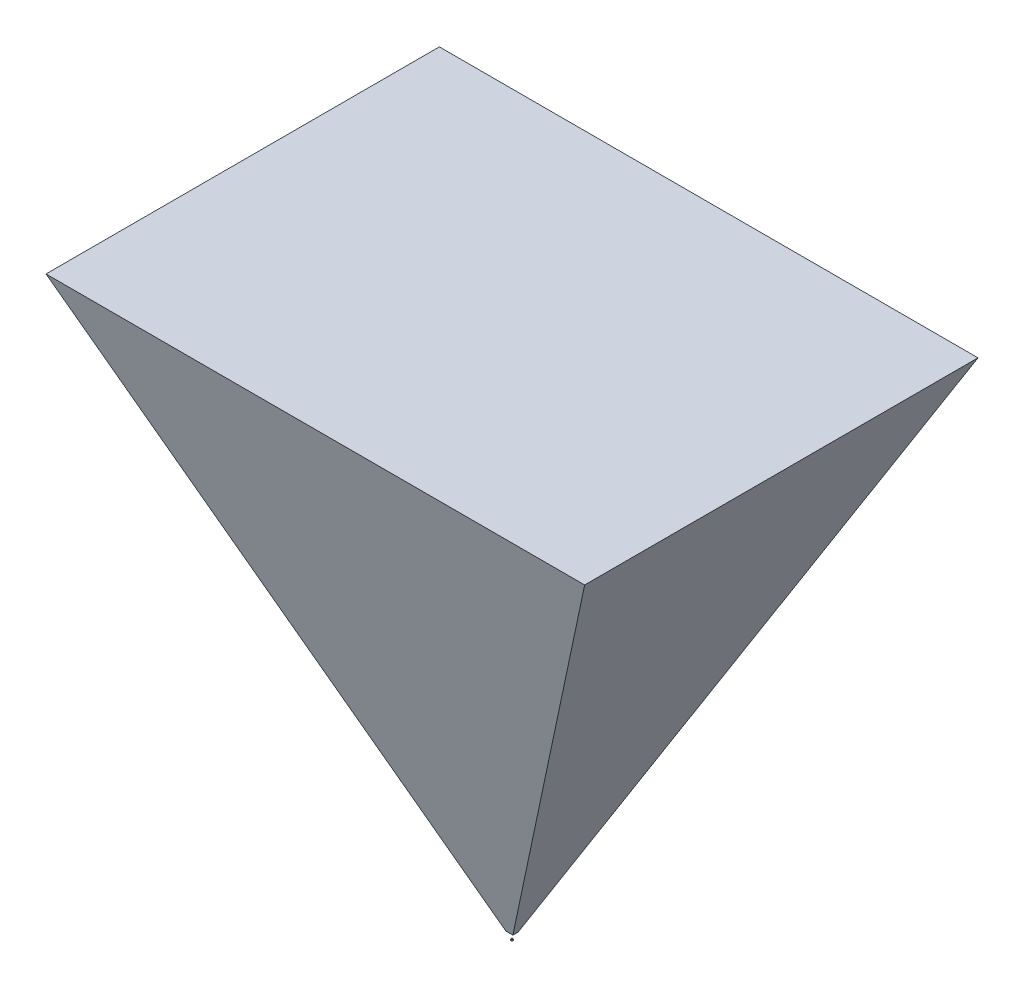
ISO-10303-21;
HEADER;
FILE_DESCRIPTION(('STEP AP214'),'2;1');
FILE_NAME('part.step','',(''),(''),'','','');
FILE_SCHEMA(('AUTOMOTIVE_DESIGN { 1 0 10303 214 1 1 1 1 }'));
ENDSEC;
DATA;
#1=APPLICATION_CONTEXT('core data for automotive mechanical design processes');
#2=APPLICATION_PROTOCOL_DEFINITION('international standard','automotive_design',2000,#1);
#3=PRODUCT_CONTEXT('',#1,'mechanical');
#4=PRODUCT('Part','Part','',(#3));
#5=PRODUCT_RELATED_PRODUCT_CATEGORY('part','',(#4));
#6=PRODUCT_DEFINITION_FORMATION('','',#4);
#7=PRODUCT_DEFINITION_CONTEXT('part definition',#1,'design');
#8=PRODUCT_DEFINITION('design','',#6,#7);
#9=PRODUCT_DEFINITION_SHAPE('','',#8);
#10=(LENGTH_UNIT() NAMED_UNIT(*) SI_UNIT(.MILLI.,.METRE.));
#11=(NAMED_UNIT(*) PLANE_ANGLE_UNIT() SI_UNIT($,.RADIAN.));
#12=(NAMED_UNIT(*) SI_UNIT($,.STERADIAN.) SOLID_ANGLE_UNIT());
#13=UNCERTAINTY_MEASURE_WITH_UNIT(LENGTH_MEASURE(1.E-05),#10,'distance_accuracy_value','');
#14=(GEOMETRIC_REPRESENTATION_CONTEXT(3) GLOBAL_UNCERTAINTY_ASSIGNED_CONTEXT((#13)) GLOBAL_UNIT_ASSIGNED_CONTEXT((#10,
#11,#12)) REPRESENTATION_CONTEXT('',''));
#15=CARTESIAN_POINT('',(0.,0.,0.));
#16=DIRECTION('',(0.,0.,1.));
#17=DIRECTION('',(1.,0.,0.));
#18=AXIS2_PLACEMENT_3D('',#15,#16,#17);
#19=CARTESIAN_POINT('',(1500.,1518.70782661284,553.234756084626));
#20=DIRECTION('',(0.,-1.,0.));
#21=DIRECTION('',(0.,0.,-1.));
#22=AXIS2_PLACEMENT_3D('',#19,#20,#21);
#23=PLANE('',#22);
#24=DIRECTION('',(0.,0.,1.));
#25=VECTOR('',#24,1.);
#26=CARTESIAN_POINT('',(-757.612893172543,1518.70782661284,-553.234756084626));
#27=LINE('',#26,#25);
#28=CARTESIAN_POINT('',(-757.612893172542,1518.70782661284,-553.234756084626));
#29=VERTEX_POINT('',#28);
#30=CARTESIAN_POINT('',(-757.612893172542,1518.70782661284,553.234756084626));
#31=VERTEX_POINT('',#30);
#32=EDGE_CURVE('E67',#29,#31,#27,.T.);
#33=ORIENTED_EDGE('',*,*,#32,.T.);
#34=DIRECTION('',(-1.,0.,0.));
#35=VECTOR('',#34,1.);
#36=CARTESIAN_POINT('',(1500.,1518.70782661284,553.234756084626));
#37=LINE('',#36,#35);
#38=CARTESIAN_POINT('',(757.612893172543,1518.70782661284,553.234756084626));
#39=VERTEX_POINT('',#38);
#40=EDGE_CURVE('E97',#39,#31,#37,.T.);
#41=ORIENTED_EDGE('',*,*,#40,.F.);
#42=DIRECTION('',(0.,0.,1.));
#43=VECTOR('',#42,1.);
#44=CARTESIAN_POINT('',(757.612893172543,1518.70782661284,-553.234756084626));
#45=LINE('',#44,#43);
#46=CARTESIAN_POINT('',(757.612893172542,1518.70782661284,-553.234756084626));
#47=VERTEX_POINT('',#46);
#48=EDGE_CURVE('E83',#47,#39,#45,.T.);
#49=ORIENTED_EDGE('',*,*,#48,.F.);
#50=DIRECTION('',(-1.,0.,0.));
#51=VECTOR('',#50,1.);
#52=CARTESIAN_POINT('',(1500.,1518.70782661284,-553.234756084626));
#53=LINE('',#52,#51);
#54=EDGE_CURVE('E109',#47,#29,#53,.T.);
#55=ORIENTED_EDGE('',*,*,#54,.T.);
#56=EDGE_LOOP('',(#33,#41,#49,#55));
#57=FACE_BOUND('',#56,.T.);
#58=ADVANCED_FACE('F46',(#57),#23,.F.);
#59=CARTESIAN_POINT('',(1500.,18.7078266128409,7.27940468532404));
#60=DIRECTION('',(0.,0.342020143325668,-0.939692620785909));
#61=DIRECTION('',(0.,0.939692620785909,0.342020143325668));
#62=AXIS2_PLACEMENT_3D('',#59,#60,#61);
#63=PLANE('',#62);
#64=DIRECTION('',(-0.424258256279284,0.850930418263275,0.309713343679521));
#65=VECTOR('',#64,1.);
#66=CARTESIAN_POINT('',(262.0053594961,-526.330009117692,-191.098144069461));
#67=LINE('',#66,#65);
#68=CARTESIAN_POINT('',(-9.7404810923923,18.7078266128409,7.27940468532406));
#69=VERTEX_POINT('',#68);
#70=EDGE_CURVE('E100',#69,#31,#67,.T.);
#71=ORIENTED_EDGE('',*,*,#70,.F.);
#72=DIRECTION('',(-1.,0.,0.));
#73=VECTOR('',#72,1.);
#74=CARTESIAN_POINT('',(1500.,18.7078266128409,7.27940468532404));
#75=LINE('',#74,#73);
#76=CARTESIAN_POINT('',(9.7404810923923,18.7078266128409,7.27940468532406));
#77=VERTEX_POINT('',#76);
#78=EDGE_CURVE('E99',#77,#69,#75,.T.);
#79=ORIENTED_EDGE('',*,*,#78,.F.);
#80=DIRECTION('',(-0.424258256279284,-0.850930418263275,-0.309713343679521));
#81=VECTOR('',#80,1.);
#82=CARTESIAN_POINT('',(277.979844567317,556.712757284446,203.097185338239));
#83=LINE('',#82,#81);
#84=EDGE_CURVE('E86',#39,#77,#83,.T.);
#85=ORIENTED_EDGE('',*,*,#84,.F.);
#86=ORIENTED_EDGE('',*,*,#40,.T.);
#87=EDGE_LOOP('',(#71,#79,#85,#86));
#88=FACE_BOUND('',#87,.T.);
#89=ADVANCED_FACE('F96',(#88),#63,.F.);
#90=CARTESIAN_POINT('',(1500.,18.7078266128409,7.27940468532404));
#91=DIRECTION('',(0.,1.,0.));
#92=DIRECTION('',(0.,0.,1.));
#93=AXIS2_PLACEMENT_3D('',#90,#91,#92);
#94=PLANE('',#93);
#95=DIRECTION('',(0.,0.,1.));
#96=VECTOR('',#95,1.);
#97=CARTESIAN_POINT('',(-9.7404810923923,18.7078266128409,-553.234756084626));
#98=LINE('',#97,#96);
#99=CARTESIAN_POINT('',(-9.74048109239218,18.7078266128409,-7.27940468532415));
#100=VERTEX_POINT('',#99);
#101=EDGE_CURVE('E101',#100,#69,#98,.T.);
#102=ORIENTED_EDGE('',*,*,#101,.F.);
#103=DIRECTION('',(-1.,0.,0.));
#104=VECTOR('',#103,1.);
#105=CARTESIAN_POINT('',(1500.,18.7078266128409,-7.27940468532404));
#106=LINE('',#105,#104);
#107=CARTESIAN_POINT('',(9.7404810923922,18.7078266128409,-7.27940468532404));
#108=VERTEX_POINT('',#107);
#109=EDGE_CURVE('E104',#108,#100,#106,.T.);
#110=ORIENTED_EDGE('',*,*,#109,.F.);
#111=DIRECTION('',(0.,0.,1.));
#112=VECTOR('',#111,1.);
#113=CARTESIAN_POINT('',(9.7404810923923,18.7078266128409,-553.234756084626));
#114=LINE('',#113,#112);
#115=EDGE_CURVE('E60',#108,#77,#114,.T.);
#116=ORIENTED_EDGE('',*,*,#115,.T.);
#117=ORIENTED_EDGE('',*,*,#78,.T.);
#118=EDGE_LOOP('',(#102,#110,#116,#117));
#119=FACE_BOUND('',#118,.T.);
#120=ADVANCED_FACE('F118',(#119),#94,.F.);
#121=CARTESIAN_POINT('',(1500.,18.7078266128409,-7.27940468532404));
#122=DIRECTION('',(0.,0.342020143325668,0.939692620785909));
#123=DIRECTION('',(0.,-0.939692620785909,0.342020143325668));
#124=AXIS2_PLACEMENT_3D('',#121,#122,#123);
#125=PLANE('',#124);
#126=DIRECTION('',(0.424258256279284,-0.850930418263275,0.309713343679521));
#127=VECTOR('',#126,1.);
#128=CARTESIAN_POINT('',(262.0053594961,-526.330009117692,191.098144069461));
#129=LINE('',#128,#127);
#130=EDGE_CURVE('E13',#29,#100,#129,.T.);
#131=ORIENTED_EDGE('',*,*,#130,.F.);
#132=ORIENTED_EDGE('',*,*,#54,.F.);
#133=DIRECTION('',(0.424258256279284,0.850930418263275,-0.309713343679521));
#134=VECTOR('',#133,1.);
#135=CARTESIAN_POINT('',(277.979844567317,556.712757284446,-203.097185338239));
#136=LINE('',#135,#134);
#137=EDGE_CURVE('E53',#108,#47,#136,.T.);
#138=ORIENTED_EDGE('',*,*,#137,.F.);
#139=ORIENTED_EDGE('',*,*,#109,.T.);
#140=EDGE_LOOP('',(#131,#132,#138,#139));
#141=FACE_BOUND('',#140,.T.);
#142=ADVANCED_FACE('F120',(#141),#125,.F.);
#143=CARTESIAN_POINT('',(9.7404810923923,18.7078266128409,-553.234756084626));
#144=DIRECTION('',(0.894934361602024,-0.44619781310981,0.));
#145=DIRECTION('',(0.44619781310981,0.894934361602024,0.));
#146=AXIS2_PLACEMENT_3D('',#143,#144,#145);
#147=PLANE('',#146);
#148=ORIENTED_EDGE('',*,*,#84,.T.);
#149=ORIENTED_EDGE('',*,*,#115,.F.);
#150=ORIENTED_EDGE('',*,*,#137,.T.);
#151=ORIENTED_EDGE('',*,*,#48,.T.);
#152=EDGE_LOOP('',(#148,#149,#150,#151));
#153=FACE_BOUND('',#152,.T.);
#154=ADVANCED_FACE('F85',(#153),#147,.T.);
#155=CARTESIAN_POINT('',(-9.7404810923923,18.7078266128409,-553.234756084626));
#156=DIRECTION('',(-0.894934361602024,-0.44619781310981,0.));
#157=DIRECTION('',(0.44619781310981,-0.894934361602024,0.));
#158=AXIS2_PLACEMENT_3D('',#155,#156,#157);
#159=PLANE('',#158);
#160=ORIENTED_EDGE('',*,*,#70,.T.);
#161=ORIENTED_EDGE('',*,*,#32,.F.);
#162=ORIENTED_EDGE('',*,*,#130,.T.);
#163=ORIENTED_EDGE('',*,*,#101,.T.);
#164=EDGE_LOOP('',(#160,#161,#162,#163));
#165=FACE_BOUND('',#164,.T.);
#166=ADVANCED_FACE('F115',(#165),#159,.T.);
#167=CLOSED_SHELL('',(#58,#89,#120,#142,#154,#166));
#168=MANIFOLD_SOLID_BREP('B2',#167);
#169=CARTESIAN_POINT('',(1.,0.8,0.));
#170=DIRECTION('',(0.,-1.,0.));
#171=DIRECTION('',(0.,0.,-1.));
#172=AXIS2_PLACEMENT_3D('',#169,#170,#171);
#173=PLANE('',#172);
#174=CARTESIAN_POINT('',(0.,0.8,0.));
#175=DIRECTION('',(0.,1.,0.));
#176=DIRECTION('',(0.,0.,1.));
#177=AXIS2_PLACEMENT_3D('',#174,#175,#176);
#178=CIRCLE('',#177,1.);
#179=CARTESIAN_POINT('',(0.,0.8,1.));
#180=VERTEX_POINT('',#179);
#181=EDGE_CURVE('E44',#180,#180,#178,.T.);
#182=ORIENTED_EDGE('',*,*,#181,.F.);
#183=EDGE_LOOP('',(#182));
#184=FACE_BOUND('',#183,.T.);
#185=DIRECTION('',(0.,0.,-1.));
#186=VECTOR('',#185,1.);
#187=CARTESIAN_POINT('',(0.,0.8,2.3));
#188=LINE('',#187,#186);
#189=CARTESIAN_POINT('',(0.,0.8,2.75));
#190=VERTEX_POINT('',#189);
#191=CARTESIAN_POINT('',(0.,0.8,2.3));
#192=VERTEX_POINT('',#191);
#193=EDGE_CURVE('E256',#190,#192,#188,.T.);
#194=ORIENTED_EDGE('',*,*,#193,.T.);
#195=CARTESIAN_POINT('',(0.,0.8,0.));
#196=DIRECTION('',(0.,1.,0.));
#197=DIRECTION('',(-0.866025403784443,0.,-0.499999999999992));
#198=AXIS2_PLACEMENT_3D('',#195,#196,#197);
#199=CIRCLE('',#198,2.3);
#200=CARTESIAN_POINT('',(1.99185842870422,0.8,1.14999999999998));
#201=VERTEX_POINT('',#200);
#202=EDGE_CURVE('E241',#192,#201,#199,.T.);
#203=ORIENTED_EDGE('',*,*,#202,.T.);
#204=DIRECTION('',(-0.866025403784443,0.,-0.499999999999992));
#205=VECTOR('',#204,1.);
#206=CARTESIAN_POINT('',(1.99185842870422,0.8,1.14999999999998));
#207=LINE('',#206,#205);
#208=CARTESIAN_POINT('',(2.38156986040722,0.8,1.37499999999998));
#209=VERTEX_POINT('',#208);
#210=EDGE_CURVE('E247',#209,#201,#207,.T.);
#211=ORIENTED_EDGE('',*,*,#210,.F.);
#212=CARTESIAN_POINT('',(0.,0.8,0.));
#213=DIRECTION('',(0.,1.,0.));
#214=DIRECTION('',(0.,0.,1.));
#215=AXIS2_PLACEMENT_3D('',#212,#213,#214);
#216=CIRCLE('',#215,2.75);
#217=CARTESIAN_POINT('',(2.38156986040721,0.8,-1.37499999999999));
#218=VERTEX_POINT('',#217);
#219=EDGE_CURVE('E327',#209,#218,#216,.T.);
#220=ORIENTED_EDGE('',*,*,#219,.T.);
#221=DIRECTION('',(-0.86602540378444,0.,0.499999999999998));
#222=VECTOR('',#221,1.);
#223=CARTESIAN_POINT('',(1.99185842870421,0.8,-1.15));
#224=LINE('',#223,#222);
#225=CARTESIAN_POINT('',(1.99185842870421,0.8,-1.15));
#226=VERTEX_POINT('',#225);
#227=EDGE_CURVE('E290',#218,#226,#224,.T.);
#228=ORIENTED_EDGE('',*,*,#227,.T.);
#229=CARTESIAN_POINT('',(0.,0.8,0.));
#230=DIRECTION('',(0.,1.,0.));
#231=DIRECTION('',(0.,0.,1.));
#232=AXIS2_PLACEMENT_3D('',#229,#230,#231);
#233=CIRCLE('',#232,2.3);
#234=CARTESIAN_POINT('',(0.,0.8,-2.3));
#235=VERTEX_POINT('',#234);
#236=EDGE_CURVE('E298',#226,#235,#233,.T.);
#237=ORIENTED_EDGE('',*,*,#236,.T.);
#238=DIRECTION('',(0.,0.,1.));
#239=VECTOR('',#238,1.);
#240=CARTESIAN_POINT('',(0.,0.8,-2.3));
#241=LINE('',#240,#239);
#242=CARTESIAN_POINT('',(0.,0.8,-2.75));
#243=VERTEX_POINT('',#242);
#244=EDGE_CURVE('E283',#243,#235,#241,.T.);
#245=ORIENTED_EDGE('',*,*,#244,.F.);
#246=CARTESIAN_POINT('',(-2.38156986040721,0.8,-1.37499999999999));
#247=VERTEX_POINT('',#246);
#248=EDGE_CURVE('E178',#243,#247,#216,.T.);
#249=ORIENTED_EDGE('',*,*,#248,.T.);
#250=DIRECTION('',(0.86602540378444,0.,0.499999999999998));
#251=VECTOR('',#250,1.);
#252=CARTESIAN_POINT('',(-1.99185842870421,0.8,-1.15));
#253=LINE('',#252,#251);
#254=CARTESIAN_POINT('',(-1.99185842870421,0.8,-1.15));
#255=VERTEX_POINT('',#254);
#256=EDGE_CURVE('E270',#247,#255,#253,.T.);
#257=ORIENTED_EDGE('',*,*,#256,.T.);
#258=CARTESIAN_POINT('',(0.,0.8,0.));
#259=DIRECTION('',(0.,1.,0.));
#260=DIRECTION('',(0.866025403784436,0.,-0.500000000000004));
#261=AXIS2_PLACEMENT_3D('',#258,#259,#260);
#262=CIRCLE('',#261,2.3);
#263=CARTESIAN_POINT('',(-1.9918584287042,0.8,1.15000000000001));
#264=VERTEX_POINT('',#263);
#265=EDGE_CURVE('E278',#255,#264,#262,.T.);
#266=ORIENTED_EDGE('',*,*,#265,.T.);
#267=DIRECTION('',(0.866025403784436,0.,-0.500000000000004));
#268=VECTOR('',#267,1.);
#269=CARTESIAN_POINT('',(-1.9918584287042,0.8,1.15000000000001));
#270=LINE('',#269,#268);
#271=CARTESIAN_POINT('',(-2.3815698604072,0.8,1.37500000000001));
#272=VERTEX_POINT('',#271);
#273=EDGE_CURVE('E259',#272,#264,#270,.T.);
#274=ORIENTED_EDGE('',*,*,#273,.F.);
#275=EDGE_CURVE('E329',#272,#190,#216,.T.);
#276=ORIENTED_EDGE('',*,*,#275,.T.);
#277=EDGE_LOOP('',(#194,#203,#211,#220,#228,#237,#245,#249,#257,#266,#274,#276));
#278=FACE_BOUND('',#277,.T.);
#279=ADVANCED_FACE('F170',(#184,#278),#173,.F.);
#280=CARTESIAN_POINT('',(0.,0.,0.));
#281=DIRECTION('',(0.,1.,0.));
#282=DIRECTION('',(0.,0.,1.));
#283=AXIS2_PLACEMENT_3D('',#280,#281,#282);
#284=CYLINDRICAL_SURFACE('',#283,2.75);
#285=CARTESIAN_POINT('',(0.,-0.2,0.));
#286=DIRECTION('',(0.,-1.,0.));
#287=DIRECTION('',(0.,0.,-1.));
#288=AXIS2_PLACEMENT_3D('',#285,#286,#287);
#289=CIRCLE('',#288,2.75);
#290=CARTESIAN_POINT('',(0.,-0.2,-2.75));
#291=VERTEX_POINT('',#290);
#292=EDGE_CURVE('E304',#291,#291,#289,.T.);
#293=ORIENTED_EDGE('',*,*,#292,.F.);
#294=EDGE_LOOP('',(#293));
#295=FACE_BOUND('',#294,.T.);
#296=DIRECTION('',(0.,1.,0.));
#297=VECTOR('',#296,1.);
#298=CARTESIAN_POINT('',(0.,0.8,2.75));
#299=LINE('',#298,#297);
#300=CARTESIAN_POINT('',(0.,0.349999999999999,2.75));
#301=VERTEX_POINT('',#300);
#302=EDGE_CURVE('E257',#301,#190,#299,.T.);
#303=ORIENTED_EDGE('',*,*,#302,.T.);
#304=ORIENTED_EDGE('',*,*,#275,.F.);
#305=DIRECTION('',(0.,1.,0.));
#306=VECTOR('',#305,1.);
#307=CARTESIAN_POINT('',(-2.3815698604072,0.8,1.37500000000001));
#308=LINE('',#307,#306);
#309=CARTESIAN_POINT('',(-2.3815698604072,0.349999999999999,1.37500000000001));
#310=VERTEX_POINT('',#309);
#311=EDGE_CURVE('E268',#310,#272,#308,.T.);
#312=ORIENTED_EDGE('',*,*,#311,.F.);
#313=CARTESIAN_POINT('',(0.,0.349999999999999,0.));
#314=DIRECTION('',(0.,1.,0.));
#315=DIRECTION('',(0.866025403784436,0.,-0.500000000000004));
#316=AXIS2_PLACEMENT_3D('',#313,#314,#315);
#317=CIRCLE('',#316,2.75);
#318=CARTESIAN_POINT('',(-2.38156986040721,0.349999999999999,-1.37499999999999));
#319=VERTEX_POINT('',#318);
#320=EDGE_CURVE('E281',#319,#310,#317,.T.);
#321=ORIENTED_EDGE('',*,*,#320,.F.);
#322=DIRECTION('',(0.,1.,0.));
#323=VECTOR('',#322,1.);
#324=CARTESIAN_POINT('',(-2.38156986040721,0.8,-1.37499999999999));
#325=LINE('',#324,#323);
#326=EDGE_CURVE('E275',#319,#247,#325,.T.);
#327=ORIENTED_EDGE('',*,*,#326,.T.);
#328=ORIENTED_EDGE('',*,*,#248,.F.);
#329=DIRECTION('',(0.,1.,0.));
#330=VECTOR('',#329,1.);
#331=CARTESIAN_POINT('',(0.,0.8,-2.75));
#332=LINE('',#331,#330);
#333=CARTESIAN_POINT('',(0.,0.349999999999999,-2.75));
#334=VERTEX_POINT('',#333);
#335=EDGE_CURVE('E288',#334,#243,#332,.T.);
#336=ORIENTED_EDGE('',*,*,#335,.F.);
#337=CARTESIAN_POINT('',(0.,0.349999999999999,0.));
#338=DIRECTION('',(0.,1.,0.));
#339=DIRECTION('',(0.,0.,1.));
#340=AXIS2_PLACEMENT_3D('',#337,#338,#339);
#341=CIRCLE('',#340,2.75);
#342=CARTESIAN_POINT('',(2.38156986040721,0.349999999999999,-1.37499999999999));
#343=VERTEX_POINT('',#342);
#344=EDGE_CURVE('E301',#343,#334,#341,.T.);
#345=ORIENTED_EDGE('',*,*,#344,.F.);
#346=DIRECTION('',(0.,1.,0.));
#347=VECTOR('',#346,1.);
#348=CARTESIAN_POINT('',(2.38156986040721,0.8,-1.37499999999999));
#349=LINE('',#348,#347);
#350=EDGE_CURVE('E295',#343,#218,#349,.T.);
#351=ORIENTED_EDGE('',*,*,#350,.T.);
#352=ORIENTED_EDGE('',*,*,#219,.F.);
#353=DIRECTION('',(0.,1.,0.));
#354=VECTOR('',#353,1.);
#355=CARTESIAN_POINT('',(2.38156986040722,0.8,1.37499999999998));
#356=LINE('',#355,#354);
#357=CARTESIAN_POINT('',(2.38156986040722,0.349999999999999,1.37499999999998));
#358=VERTEX_POINT('',#357);
#359=EDGE_CURVE('E246',#358,#209,#356,.T.);
#360=ORIENTED_EDGE('',*,*,#359,.F.);
#361=CARTESIAN_POINT('',(0.,0.349999999999999,0.));
#362=DIRECTION('',(0.,1.,0.));
#363=DIRECTION('',(-0.866025403784443,0.,-0.499999999999992));
#364=AXIS2_PLACEMENT_3D('',#361,#362,#363);
#365=CIRCLE('',#364,2.75);
#366=EDGE_CURVE('E244',#301,#358,#365,.T.);
#367=ORIENTED_EDGE('',*,*,#366,.F.);
#368=EDGE_LOOP('',(#303,#304,#312,#321,#327,#328,#336,#345,#351,#352,#360,#367));
#369=FACE_BOUND('',#368,.T.);
#370=ADVANCED_FACE('F339',(#295,#369),#284,.T.);
#371=CARTESIAN_POINT('',(0.,-1.2,0.));
#372=DIRECTION('',(0.,-1.,0.));
#373=DIRECTION('',(0.,0.,-1.));
#374=AXIS2_PLACEMENT_3D('',#371,#372,#373);
#375=CIRCLE('',#374,2.75);
#376=CARTESIAN_POINT('',(0.,-1.2,-2.75));
#377=VERTEX_POINT('',#376);
#378=EDGE_CURVE('E313',#377,#377,#375,.T.);
#379=ORIENTED_EDGE('',*,*,#378,.T.);
#380=EDGE_LOOP('',(#379));
#381=FACE_BOUND('',#380,.T.);
#382=CARTESIAN_POINT('',(0.,-2.55,0.));
#383=DIRECTION('',(0.,1.,0.));
#384=DIRECTION('',(0.,0.,1.));
#385=AXIS2_PLACEMENT_3D('',#382,#383,#384);
#386=CIRCLE('',#385,2.75);
#387=CARTESIAN_POINT('',(0.,-2.55,2.75));
#388=VERTEX_POINT('',#387);
#389=EDGE_CURVE('E325',#388,#388,#386,.T.);
#390=ORIENTED_EDGE('',*,*,#389,.T.);
#391=EDGE_LOOP('',(#390));
#392=FACE_BOUND('',#391,.T.);
#393=ADVANCED_FACE('F373',(#381,#392),#284,.T.);
#394=CARTESIAN_POINT('',(2.75,-2.55,0.));
#395=DIRECTION('',(0.,1.,0.));
#396=DIRECTION('',(0.,0.,1.));
#397=AXIS2_PLACEMENT_3D('',#394,#395,#396);
#398=PLANE('',#397);
#399=ORIENTED_EDGE('',*,*,#389,.F.);
#400=EDGE_LOOP('',(#399));
#401=FACE_BOUND('',#400,.T.);
#402=CARTESIAN_POINT('',(0.,-2.55,0.));
#403=DIRECTION('',(0.,1.,0.));
#404=DIRECTION('',(0.,0.,1.));
#405=AXIS2_PLACEMENT_3D('',#402,#403,#404);
#406=CIRCLE('',#405,2.1);
#407=CARTESIAN_POINT('',(0.,-2.55,2.1));
#408=VERTEX_POINT('',#407);
#409=EDGE_CURVE('E322',#408,#408,#406,.T.);
#410=ORIENTED_EDGE('',*,*,#409,.T.);
#411=EDGE_LOOP('',(#410));
#412=FACE_BOUND('',#411,.T.);
#413=ADVANCED_FACE('F378',(#401,#412),#398,.F.);
#414=CARTESIAN_POINT('',(0.,-2.25,0.));
#415=DIRECTION('',(0.,-1.,0.));
#416=DIRECTION('',(0.,0.,-1.));
#417=AXIS2_PLACEMENT_3D('',#414,#415,#416);
#418=CONICAL_SURFACE('',#417,1.8,0.78539816339745);
#419=ORIENTED_EDGE('',*,*,#409,.F.);
#420=EDGE_LOOP('',(#419));
#421=FACE_BOUND('',#420,.T.);
#422=CARTESIAN_POINT('',(0.,-2.25,0.));
#423=DIRECTION('',(0.,1.,0.));
#424=DIRECTION('',(0.,0.,1.));
#425=AXIS2_PLACEMENT_3D('',#422,#423,#424);
#426=CIRCLE('',#425,1.8);
#427=CARTESIAN_POINT('',(0.,-2.25,1.8));
#428=VERTEX_POINT('',#427);
#429=EDGE_CURVE('E319',#428,#428,#426,.T.);
#430=ORIENTED_EDGE('',*,*,#429,.T.);
#431=EDGE_LOOP('',(#430));
#432=FACE_BOUND('',#431,.T.);
#433=ADVANCED_FACE('F381',(#421,#432),#418,.F.);
#434=CARTESIAN_POINT('',(0.,3.,0.));
#435=DIRECTION('',(0.,1.,0.));
#436=DIRECTION('',(1.,0.,0.));
#437=AXIS2_PLACEMENT_3D('',#434,#435,#436);
#438=SPHERICAL_SURFACE('',#437,5.55);
#439=ORIENTED_EDGE('',*,*,#429,.F.);
#440=EDGE_LOOP('',(#439));
#441=FACE_BOUND('',#440,.T.);
#442=ADVANCED_FACE('F385',(#441),#438,.T.);
#443=CARTESIAN_POINT('',(2.75,-1.2,0.));
#444=DIRECTION('',(0.,-1.,0.));
#445=DIRECTION('',(0.,0.,-1.));
#446=AXIS2_PLACEMENT_3D('',#443,#444,#445);
#447=PLANE('',#446);
#448=CARTESIAN_POINT('',(0.,-1.2,0.));
#449=DIRECTION('',(0.,-1.,0.));
#450=DIRECTION('',(0.,0.,-1.));
#451=AXIS2_PLACEMENT_3D('',#448,#449,#450);
#452=CIRCLE('',#451,3.);
#453=CARTESIAN_POINT('',(0.,-1.2,-3.));
#454=VERTEX_POINT('',#453);
#455=EDGE_CURVE('E310',#454,#454,#452,.T.);
#456=ORIENTED_EDGE('',*,*,#455,.T.);
#457=EDGE_LOOP('',(#456));
#458=FACE_BOUND('',#457,.T.);
#459=ORIENTED_EDGE('',*,*,#378,.F.);
#460=EDGE_LOOP('',(#459));
#461=FACE_BOUND('',#460,.T.);
#462=ADVANCED_FACE('F389',(#458,#461),#447,.T.);
#463=CARTESIAN_POINT('',(0.,0.,0.));
#464=DIRECTION('',(0.,-1.,0.));
#465=DIRECTION('',(0.,0.,-1.));
#466=AXIS2_PLACEMENT_3D('',#463,#464,#465);
#467=CYLINDRICAL_SURFACE('',#466,3.);
#468=CARTESIAN_POINT('',(0.,-0.2,0.));
#469=DIRECTION('',(0.,-1.,0.));
#470=DIRECTION('',(0.,0.,-1.));
#471=AXIS2_PLACEMENT_3D('',#468,#469,#470);
#472=CIRCLE('',#471,3.);
#473=CARTESIAN_POINT('',(0.,-0.2,-3.));
#474=VERTEX_POINT('',#473);
#475=EDGE_CURVE('E307',#474,#474,#472,.T.);
#476=ORIENTED_EDGE('',*,*,#475,.T.);
#477=EDGE_LOOP('',(#476));
#478=FACE_BOUND('',#477,.T.);
#479=ORIENTED_EDGE('',*,*,#455,.F.);
#480=EDGE_LOOP('',(#479));
#481=FACE_BOUND('',#480,.T.);
#482=ADVANCED_FACE('F398',(#478,#481),#467,.T.);
#483=CARTESIAN_POINT('',(2.75,-0.2,0.));
#484=DIRECTION('',(0.,1.,0.));
#485=DIRECTION('',(0.,0.,1.));
#486=AXIS2_PLACEMENT_3D('',#483,#484,#485);
#487=PLANE('',#486);
#488=ORIENTED_EDGE('',*,*,#292,.T.);
#489=EDGE_LOOP('',(#488));
#490=FACE_BOUND('',#489,.T.);
#491=ORIENTED_EDGE('',*,*,#475,.F.);
#492=EDGE_LOOP('',(#491));
#493=FACE_BOUND('',#492,.T.);
#494=ADVANCED_FACE('F394',(#490,#493),#487,.T.);
#495=CARTESIAN_POINT('',(0.,-1.478125,0.));
#496=DIRECTION('',(0.,1.,0.));
#497=DIRECTION('',(1.,0.,0.));
#498=AXIS2_PLACEMENT_3D('',#495,#496,#497);
#499=SPHERICAL_SURFACE('',#498,2.003125);
#500=CARTESIAN_POINT('',(0.,0.425,0.));
#501=DIRECTION('',(0.,1.,0.));
#502=DIRECTION('',(0.,0.,1.));
#503=AXIS2_PLACEMENT_3D('',#500,#501,#502);
#504=CIRCLE('',#503,0.625);
#505=CARTESIAN_POINT('',(0.,0.425,0.625));
#506=VERTEX_POINT('',#505);
#507=EDGE_CURVE('E316',#506,#506,#504,.T.);
#508=ORIENTED_EDGE('',*,*,#507,.T.);
#509=EDGE_LOOP('',(#508));
#510=FACE_BOUND('',#509,.T.);
#511=ADVANCED_FACE('F391',(#510),#499,.T.);
#512=CARTESIAN_POINT('',(0.,0.8,0.));
#513=DIRECTION('',(0.,1.,0.));
#514=DIRECTION('',(0.,0.,1.));
#515=AXIS2_PLACEMENT_3D('',#512,#513,#514);
#516=CONICAL_SURFACE('',#515,1.,0.785398163397449);
#517=ORIENTED_EDGE('',*,*,#507,.F.);
#518=EDGE_LOOP('',(#517));
#519=FACE_BOUND('',#518,.T.);
#520=ORIENTED_EDGE('',*,*,#181,.T.);
#521=EDGE_LOOP('',(#520));
#522=FACE_BOUND('',#521,.T.);
#523=ADVANCED_FACE('F172',(#519,#522),#516,.F.);
#524=CARTESIAN_POINT('',(0.,0.8,0.));
#525=DIRECTION('',(0.,-1.,0.));
#526=DIRECTION('',(0.,0.,-1.));
#527=AXIS2_PLACEMENT_3D('',#524,#525,#526);
#528=CONICAL_SURFACE('',#527,2.3,0.785398163397448);
#529=DIRECTION('',(0.612372435695795,-0.707106781186547,-0.353553390593272));
#530=VECTOR('',#529,1.);
#531=CARTESIAN_POINT('',(2.38156986040721,0.349999999999999,-1.37499999999999));
#532=LINE('',#531,#530);
#533=EDGE_CURVE('E293',#226,#343,#532,.T.);
#534=ORIENTED_EDGE('',*,*,#533,.T.);
#535=ORIENTED_EDGE('',*,*,#344,.T.);
#536=DIRECTION('',(0.,-0.707106781186547,-0.707106781186547));
#537=VECTOR('',#536,1.);
#538=CARTESIAN_POINT('',(0.,0.349999999999999,-2.75));
#539=LINE('',#538,#537);
#540=EDGE_CURVE('E286',#235,#334,#539,.T.);
#541=ORIENTED_EDGE('',*,*,#540,.F.);
#542=ORIENTED_EDGE('',*,*,#236,.F.);
#543=EDGE_LOOP('',(#534,#535,#541,#542));
#544=FACE_BOUND('',#543,.T.);
#545=ADVANCED_FACE('F342',(#544),#528,.T.);
#546=CARTESIAN_POINT('',(0.,0.,0.));
#547=DIRECTION('',(-0.499999999999998,0.,-0.86602540378444));
#548=DIRECTION('',(-0.86602540378444,0.,0.499999999999998));
#549=AXIS2_PLACEMENT_3D('',#546,#547,#548);
#550=PLANE('',#549);
#551=ORIENTED_EDGE('',*,*,#227,.F.);
#552=ORIENTED_EDGE('',*,*,#350,.F.);
#553=ORIENTED_EDGE('',*,*,#533,.F.);
#554=EDGE_LOOP('',(#551,#552,#553));
#555=FACE_BOUND('',#554,.T.);
#556=ADVANCED_FACE('F337',(#555),#550,.T.);
#557=CARTESIAN_POINT('',(0.,0.,0.));
#558=DIRECTION('',(-1.,0.,0.));
#559=DIRECTION('',(0.,0.,1.));
#560=AXIS2_PLACEMENT_3D('',#557,#558,#559);
#561=PLANE('',#560);
#562=ORIENTED_EDGE('',*,*,#244,.T.);
#563=ORIENTED_EDGE('',*,*,#540,.T.);
#564=ORIENTED_EDGE('',*,*,#335,.T.);
#565=EDGE_LOOP('',(#562,#563,#564));
#566=FACE_BOUND('',#565,.T.);
#567=ADVANCED_FACE('F410',(#566),#561,.F.);
#568=CARTESIAN_POINT('',(0.,0.8,0.));
#569=DIRECTION('',(0.,-1.,0.));
#570=DIRECTION('',(-0.866025403784436,0.,0.500000000000004));
#571=AXIS2_PLACEMENT_3D('',#568,#569,#570);
#572=CONICAL_SURFACE('',#571,2.3,0.785398163397448);
#573=DIRECTION('',(-0.612372435695795,-0.707106781186547,-0.353553390593272));
#574=VECTOR('',#573,1.);
#575=CARTESIAN_POINT('',(-2.38156986040721,0.349999999999999,-1.37499999999999));
#576=LINE('',#575,#574);
#577=EDGE_CURVE('E273',#255,#319,#576,.T.);
#578=ORIENTED_EDGE('',*,*,#577,.T.);
#579=ORIENTED_EDGE('',*,*,#320,.T.);
#580=DIRECTION('',(-0.612372435695793,-0.707106781186547,0.353553390593277));
#581=VECTOR('',#580,1.);
#582=CARTESIAN_POINT('',(-2.3815698604072,0.349999999999999,1.37500000000001));
#583=LINE('',#582,#581);
#584=EDGE_CURVE('E193',#264,#310,#583,.T.);
#585=ORIENTED_EDGE('',*,*,#584,.F.);
#586=ORIENTED_EDGE('',*,*,#265,.F.);
#587=EDGE_LOOP('',(#578,#579,#585,#586));
#588=FACE_BOUND('',#587,.T.);
#589=ADVANCED_FACE('F353',(#588),#572,.T.);
#590=CARTESIAN_POINT('',(0.,0.,0.));
#591=DIRECTION('',(-0.499999999999998,0.,0.86602540378444));
#592=DIRECTION('',(0.86602540378444,0.,0.499999999999998));
#593=AXIS2_PLACEMENT_3D('',#590,#591,#592);
#594=PLANE('',#593);
#595=ORIENTED_EDGE('',*,*,#256,.F.);
#596=ORIENTED_EDGE('',*,*,#326,.F.);
#597=ORIENTED_EDGE('',*,*,#577,.F.);
#598=EDGE_LOOP('',(#595,#596,#597));
#599=FACE_BOUND('',#598,.T.);
#600=ADVANCED_FACE('F349',(#599),#594,.T.);
#601=CARTESIAN_POINT('',(0.,0.,0.));
#602=DIRECTION('',(0.500000000000004,0.,0.866025403784436));
#603=DIRECTION('',(0.866025403784436,0.,-0.500000000000004));
#604=AXIS2_PLACEMENT_3D('',#601,#602,#603);
#605=PLANE('',#604);
#606=ORIENTED_EDGE('',*,*,#273,.T.);
#607=ORIENTED_EDGE('',*,*,#584,.T.);
#608=ORIENTED_EDGE('',*,*,#311,.T.);
#609=EDGE_LOOP('',(#606,#607,#608));
#610=FACE_BOUND('',#609,.T.);
#611=ADVANCED_FACE('F354',(#610),#605,.F.);
#612=CARTESIAN_POINT('',(0.,0.8,0.));
#613=DIRECTION('',(0.,-1.,0.));
#614=DIRECTION('',(0.866025403784443,0.,0.499999999999992));
#615=AXIS2_PLACEMENT_3D('',#612,#613,#614);
#616=CONICAL_SURFACE('',#615,2.3,0.785398163397448);
#617=DIRECTION('',(0.,-0.707106781186547,0.707106781186547));
#618=VECTOR('',#617,1.);
#619=CARTESIAN_POINT('',(0.,0.349999999999999,2.75));
#620=LINE('',#619,#618);
#621=EDGE_CURVE('E262',#192,#301,#620,.T.);
#622=ORIENTED_EDGE('',*,*,#621,.T.);
#623=ORIENTED_EDGE('',*,*,#366,.T.);
#624=DIRECTION('',(0.612372435695798,-0.707106781186547,0.353553390593268));
#625=VECTOR('',#624,1.);
#626=CARTESIAN_POINT('',(2.38156986040722,0.349999999999999,1.37499999999998));
#627=LINE('',#626,#625);
#628=EDGE_CURVE('E185',#201,#358,#627,.T.);
#629=ORIENTED_EDGE('',*,*,#628,.F.);
#630=ORIENTED_EDGE('',*,*,#202,.F.);
#631=EDGE_LOOP('',(#622,#623,#629,#630));
#632=FACE_BOUND('',#631,.T.);
#633=ADVANCED_FACE('F239',(#632),#616,.T.);
#634=CARTESIAN_POINT('',(0.,0.,0.));
#635=DIRECTION('',(1.,0.,0.));
#636=DIRECTION('',(0.,0.,-1.));
#637=AXIS2_PLACEMENT_3D('',#634,#635,#636);
#638=PLANE('',#637);
#639=ORIENTED_EDGE('',*,*,#193,.F.);
#640=ORIENTED_EDGE('',*,*,#302,.F.);
#641=ORIENTED_EDGE('',*,*,#621,.F.);
#642=EDGE_LOOP('',(#639,#640,#641));
#643=FACE_BOUND('',#642,.T.);
#644=ADVANCED_FACE('F357',(#643),#638,.T.);
#645=CARTESIAN_POINT('',(0.,0.,0.));
#646=DIRECTION('',(0.499999999999992,0.,-0.866025403784443));
#647=DIRECTION('',(-0.866025403784443,0.,-0.499999999999992));
#648=AXIS2_PLACEMENT_3D('',#645,#646,#647);
#649=PLANE('',#648);
#650=ORIENTED_EDGE('',*,*,#210,.T.);
#651=ORIENTED_EDGE('',*,*,#628,.T.);
#652=ORIENTED_EDGE('',*,*,#359,.T.);
#653=EDGE_LOOP('',(#650,#651,#652));
#654=FACE_BOUND('',#653,.T.);
#655=ADVANCED_FACE('F250',(#654),#649,.F.);
#656=CLOSED_SHELL('',(#279,#370,#393,#413,#433,#442,#462,#482,#494,#511,#523,#545,#556,#567,
#589,#600,#611,#633,#644,#655));
#657=MANIFOLD_SOLID_BREP('B7',#656);
#658=ADVANCED_BREP_SHAPE_REPRESENTATION('',(#18,#168,#657),#14);
#659=SHAPE_DEFINITION_REPRESENTATION(#9,#658);
ENDSEC;
END-ISO-10303-21;
